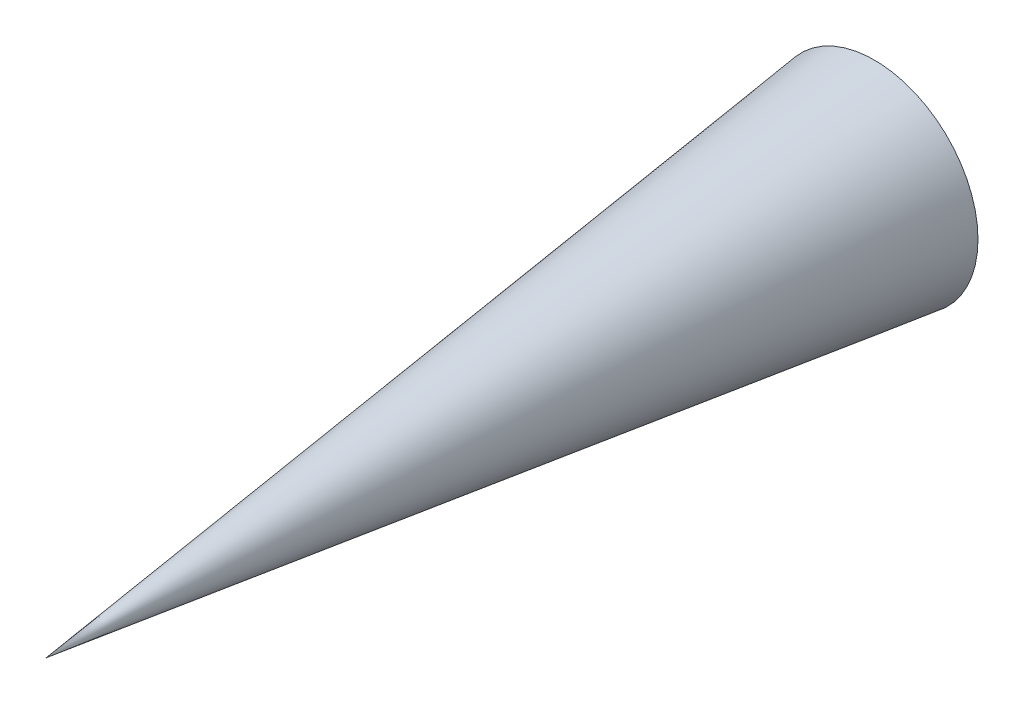
ISO-10303-21;
HEADER;
FILE_DESCRIPTION(('STEP AP214'),'2;1');
FILE_NAME('part.step','',(''),(''),'','','');
FILE_SCHEMA(('AUTOMOTIVE_DESIGN { 1 0 10303 214 1 1 1 1 }'));
ENDSEC;
DATA;
#1=APPLICATION_CONTEXT('core data for automotive mechanical design processes');
#2=APPLICATION_PROTOCOL_DEFINITION('international standard','automotive_design',2000,#1);
#3=PRODUCT_CONTEXT('',#1,'mechanical');
#4=PRODUCT('Part','Part','',(#3));
#5=PRODUCT_RELATED_PRODUCT_CATEGORY('part','',(#4));
#6=PRODUCT_DEFINITION_FORMATION('','',#4);
#7=PRODUCT_DEFINITION_CONTEXT('part definition',#1,'design');
#8=PRODUCT_DEFINITION('design','',#6,#7);
#9=PRODUCT_DEFINITION_SHAPE('','',#8);
#10=(LENGTH_UNIT() NAMED_UNIT(*) SI_UNIT(.MILLI.,.METRE.));
#11=(NAMED_UNIT(*) PLANE_ANGLE_UNIT() SI_UNIT($,.RADIAN.));
#12=(NAMED_UNIT(*) SI_UNIT($,.STERADIAN.) SOLID_ANGLE_UNIT());
#13=UNCERTAINTY_MEASURE_WITH_UNIT(LENGTH_MEASURE(1.E-05),#10,'distance_accuracy_value','');
#14=(GEOMETRIC_REPRESENTATION_CONTEXT(3) GLOBAL_UNCERTAINTY_ASSIGNED_CONTEXT((#13)) GLOBAL_UNIT_ASSIGNED_CONTEXT((#10,
#11,#12)) REPRESENTATION_CONTEXT('',''));
#15=CARTESIAN_POINT('',(0.,0.,0.));
#16=DIRECTION('',(0.,0.,1.));
#17=DIRECTION('',(1.,0.,0.));
#18=AXIS2_PLACEMENT_3D('',#15,#16,#17);
#19=CARTESIAN_POINT('',(0.,0.,0.));
#20=DIRECTION('',(0.,0.,1.));
#21=DIRECTION('',(1.,0.,0.));
#22=AXIS2_PLACEMENT_3D('',#19,#20,#21);
#23=PLANE('',#22);
#24=CARTESIAN_POINT('',(0.,0.,0.));
#25=DIRECTION('',(0.,0.,1.));
#26=DIRECTION('',(1.,0.,0.));
#27=AXIS2_PLACEMENT_3D('',#24,#25,#26);
#28=CIRCLE('',#27,5.);
#29=CARTESIAN_POINT('',(5.,0.,0.));
#30=VERTEX_POINT('',#29);
#31=EDGE_CURVE('E12',#30,#30,#28,.T.);
#32=ORIENTED_EDGE('',*,*,#31,.F.);
#33=EDGE_LOOP('',(#32));
#34=FACE_BOUND('',#33,.T.);
#35=ADVANCED_FACE('F66',(#34),#23,.F.);
#36=CARTESIAN_POINT('',(0.,0.,40.));
#37=DIRECTION('',(0.,0.,-1.));
#38=DIRECTION('',(-1.,0.,0.));
#39=AXIS2_PLACEMENT_3D('',#36,#37,#38);
#40=CONICAL_SURFACE('',#39,0.,0.124354994546761);
#41=ORIENTED_EDGE('',*,*,#31,.T.);
#42=EDGE_LOOP('',(#41));
#43=FACE_BOUND('',#42,.T.);
#44=CARTESIAN_POINT('',(0.,0.,40.));
#45=VERTEX_POINT('',#44);
#46=VERTEX_LOOP('',#45);
#47=FACE_BOUND('',#46,.T.);
#48=ADVANCED_FACE('F74',(#43,#47),#40,.T.);
#49=CLOSED_SHELL('',(#35,#48));
#50=MANIFOLD_SOLID_BREP('B2',#49);
#51=ADVANCED_BREP_SHAPE_REPRESENTATION('',(#18,#50),#14);
#52=SHAPE_DEFINITION_REPRESENTATION(#9,#51);
ENDSEC;
END-ISO-10303-21;
